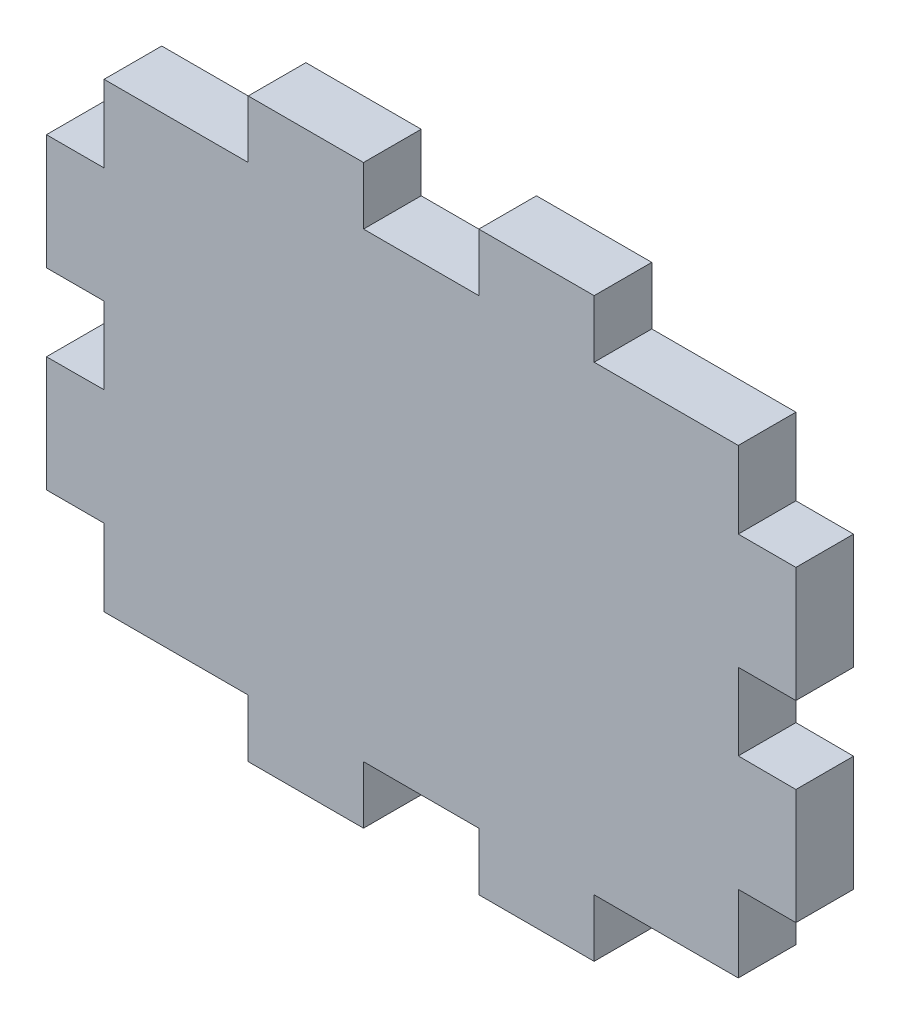
ISO-10303-21;
HEADER;
FILE_DESCRIPTION(('STEP AP214'),'2;1');
FILE_NAME('part.step','',(''),(''),'','','');
FILE_SCHEMA(('AUTOMOTIVE_DESIGN { 1 0 10303 214 1 1 1 1 }'));
ENDSEC;
DATA;
#1=APPLICATION_CONTEXT('core data for automotive mechanical design processes');
#2=APPLICATION_PROTOCOL_DEFINITION('international standard','automotive_design',2000,#1);
#3=PRODUCT_CONTEXT('',#1,'mechanical');
#4=PRODUCT('Part','Part','',(#3));
#5=PRODUCT_RELATED_PRODUCT_CATEGORY('part','',(#4));
#6=PRODUCT_DEFINITION_FORMATION('','',#4);
#7=PRODUCT_DEFINITION_CONTEXT('part definition',#1,'design');
#8=PRODUCT_DEFINITION('design','',#6,#7);
#9=PRODUCT_DEFINITION_SHAPE('','',#8);
#10=(LENGTH_UNIT() NAMED_UNIT(*) SI_UNIT(.MILLI.,.METRE.));
#11=(NAMED_UNIT(*) PLANE_ANGLE_UNIT() SI_UNIT($,.RADIAN.));
#12=(NAMED_UNIT(*) SI_UNIT($,.STERADIAN.) SOLID_ANGLE_UNIT());
#13=UNCERTAINTY_MEASURE_WITH_UNIT(LENGTH_MEASURE(1.E-05),#10,'distance_accuracy_value','');
#14=(GEOMETRIC_REPRESENTATION_CONTEXT(3) GLOBAL_UNCERTAINTY_ASSIGNED_CONTEXT((#13)) GLOBAL_UNIT_ASSIGNED_CONTEXT((#10,
#11,#12)) REPRESENTATION_CONTEXT('',''));
#15=CARTESIAN_POINT('',(0.,0.,0.));
#16=DIRECTION('',(0.,0.,1.));
#17=DIRECTION('',(1.,0.,0.));
#18=AXIS2_PLACEMENT_3D('',#15,#16,#17);
#19=CARTESIAN_POINT('',(7.50000000000001,0.,2.5));
#20=DIRECTION('',(-1.,0.,0.));
#21=DIRECTION('',(0.,0.,1.));
#22=AXIS2_PLACEMENT_3D('',#19,#20,#21);
#23=PLANE('',#22);
#24=DIRECTION('',(0.,1.,0.));
#25=VECTOR('',#24,1.);
#26=CARTESIAN_POINT('',(7.50000000000001,0.,0.));
#27=LINE('',#26,#25);
#28=CARTESIAN_POINT('',(7.50000000000001,10.,0.));
#29=VERTEX_POINT('',#28);
#30=CARTESIAN_POINT('',(7.50000000000001,12.5,0.));
#31=VERTEX_POINT('',#30);
#32=EDGE_CURVE('E543',#29,#31,#27,.T.);
#33=ORIENTED_EDGE('',*,*,#32,.T.);
#34=DIRECTION('',(0.,0.,-1.));
#35=VECTOR('',#34,1.);
#36=CARTESIAN_POINT('',(7.50000000000001,12.5,2.5));
#37=LINE('',#36,#35);
#38=CARTESIAN_POINT('',(7.50000000000001,12.5,2.5));
#39=VERTEX_POINT('',#38);
#40=EDGE_CURVE('E696',#39,#31,#37,.T.);
#41=ORIENTED_EDGE('',*,*,#40,.F.);
#42=DIRECTION('',(0.,1.,0.));
#43=VECTOR('',#42,1.);
#44=CARTESIAN_POINT('',(7.50000000000001,0.,2.5));
#45=LINE('',#44,#43);
#46=CARTESIAN_POINT('',(7.50000000000001,10.,2.5));
#47=VERTEX_POINT('',#46);
#48=EDGE_CURVE('E701',#47,#39,#45,.T.);
#49=ORIENTED_EDGE('',*,*,#48,.F.);
#50=DIRECTION('',(0.,0.,-1.));
#51=VECTOR('',#50,1.);
#52=CARTESIAN_POINT('',(7.50000000000001,10.,2.5));
#53=LINE('',#52,#51);
#54=EDGE_CURVE('E284',#47,#29,#53,.T.);
#55=ORIENTED_EDGE('',*,*,#54,.T.);
#56=EDGE_LOOP('',(#33,#41,#49,#55));
#57=FACE_BOUND('',#56,.T.);
#58=ADVANCED_FACE('F275',(#57),#23,.F.);
#59=CARTESIAN_POINT('',(0.,12.5,2.5));
#60=DIRECTION('',(0.,1.,0.));
#61=DIRECTION('',(0.,0.,1.));
#62=AXIS2_PLACEMENT_3D('',#59,#60,#61);
#63=PLANE('',#62);
#64=DIRECTION('',(1.,0.,0.));
#65=VECTOR('',#64,1.);
#66=CARTESIAN_POINT('',(0.,12.5,0.));
#67=LINE('',#66,#65);
#68=CARTESIAN_POINT('',(2.50000000000001,12.5,0.));
#69=VERTEX_POINT('',#68);
#70=EDGE_CURVE('E548',#69,#31,#67,.T.);
#71=ORIENTED_EDGE('',*,*,#70,.F.);
#72=DIRECTION('',(0.,0.,-1.));
#73=VECTOR('',#72,1.);
#74=CARTESIAN_POINT('',(2.50000000000001,12.5,2.5));
#75=LINE('',#74,#73);
#76=CARTESIAN_POINT('',(2.50000000000001,12.5,2.5));
#77=VERTEX_POINT('',#76);
#78=EDGE_CURVE('E694',#77,#69,#75,.T.);
#79=ORIENTED_EDGE('',*,*,#78,.F.);
#80=DIRECTION('',(1.,0.,0.));
#81=VECTOR('',#80,1.);
#82=CARTESIAN_POINT('',(0.,12.5,2.5));
#83=LINE('',#82,#81);
#84=EDGE_CURVE('E848',#77,#39,#83,.T.);
#85=ORIENTED_EDGE('',*,*,#84,.T.);
#86=ORIENTED_EDGE('',*,*,#40,.T.);
#87=EDGE_LOOP('',(#71,#79,#85,#86));
#88=FACE_BOUND('',#87,.T.);
#89=ADVANCED_FACE('F733',(#88),#63,.T.);
#90=CARTESIAN_POINT('',(2.50000000000001,0.,2.5));
#91=DIRECTION('',(-1.,0.,0.));
#92=DIRECTION('',(0.,-1.,0.));
#93=AXIS2_PLACEMENT_3D('',#90,#91,#92);
#94=PLANE('',#93);
#95=DIRECTION('',(0.,1.,0.));
#96=VECTOR('',#95,1.);
#97=CARTESIAN_POINT('',(2.50000000000001,0.,0.));
#98=LINE('',#97,#96);
#99=CARTESIAN_POINT('',(2.50000000000001,10.,0.));
#100=VERTEX_POINT('',#99);
#101=EDGE_CURVE('E551',#100,#69,#98,.T.);
#102=ORIENTED_EDGE('',*,*,#101,.F.);
#103=DIRECTION('',(0.,0.,-1.));
#104=VECTOR('',#103,1.);
#105=CARTESIAN_POINT('',(2.50000000000001,10.,2.5));
#106=LINE('',#105,#104);
#107=CARTESIAN_POINT('',(2.50000000000001,10.,2.5));
#108=VERTEX_POINT('',#107);
#109=EDGE_CURVE('E692',#108,#100,#106,.T.);
#110=ORIENTED_EDGE('',*,*,#109,.F.);
#111=DIRECTION('',(0.,1.,0.));
#112=VECTOR('',#111,1.);
#113=CARTESIAN_POINT('',(2.50000000000001,0.,2.5));
#114=LINE('',#113,#112);
#115=EDGE_CURVE('E845',#108,#77,#114,.T.);
#116=ORIENTED_EDGE('',*,*,#115,.T.);
#117=ORIENTED_EDGE('',*,*,#78,.T.);
#118=EDGE_LOOP('',(#102,#110,#116,#117));
#119=FACE_BOUND('',#118,.T.);
#120=ADVANCED_FACE('F723',(#119),#94,.T.);
#121=CARTESIAN_POINT('',(0.,0.,0.));
#122=DIRECTION('',(0.,0.,1.));
#123=DIRECTION('',(1.,0.,0.));
#124=AXIS2_PLACEMENT_3D('',#121,#122,#123);
#125=PLANE('',#124);
#126=DIRECTION('',(0.,-1.,0.));
#127=VECTOR('',#126,1.);
#128=CARTESIAN_POINT('',(2.5,0.,0.));
#129=LINE('',#128,#127);
#130=CARTESIAN_POINT('',(2.50000000000001,-10.,0.));
#131=VERTEX_POINT('',#130);
#132=CARTESIAN_POINT('',(2.50000000000001,-12.5,0.));
#133=VERTEX_POINT('',#132);
#134=EDGE_CURVE('E593',#131,#133,#129,.T.);
#135=ORIENTED_EDGE('',*,*,#134,.F.);
#136=DIRECTION('',(1.,0.,0.));
#137=VECTOR('',#136,1.);
#138=CARTESIAN_POINT('',(0.,-10.,0.));
#139=LINE('',#138,#137);
#140=CARTESIAN_POINT('',(-2.49999999999999,-10.,0.));
#141=VERTEX_POINT('',#140);
#142=EDGE_CURVE('E585',#141,#131,#139,.T.);
#143=ORIENTED_EDGE('',*,*,#142,.F.);
#144=DIRECTION('',(0.,-1.,0.));
#145=VECTOR('',#144,1.);
#146=CARTESIAN_POINT('',(-2.5,0.,0.));
#147=LINE('',#146,#145);
#148=CARTESIAN_POINT('',(-2.49999999999999,-12.5000000000001,0.));
#149=VERTEX_POINT('',#148);
#150=EDGE_CURVE('E590',#141,#149,#147,.T.);
#151=ORIENTED_EDGE('',*,*,#150,.T.);
#152=DIRECTION('',(1.,0.,0.));
#153=VECTOR('',#152,1.);
#154=CARTESIAN_POINT('',(0.,-12.5000000000001,0.));
#155=LINE('',#154,#153);
#156=CARTESIAN_POINT('',(-7.49999999999999,-12.5000000000001,0.));
#157=VERTEX_POINT('',#156);
#158=EDGE_CURVE('E587',#157,#149,#155,.T.);
#159=ORIENTED_EDGE('',*,*,#158,.F.);
#160=DIRECTION('',(0.,-1.,0.));
#161=VECTOR('',#160,1.);
#162=CARTESIAN_POINT('',(-7.5,0.,0.));
#163=LINE('',#162,#161);
#164=CARTESIAN_POINT('',(-7.49999999999999,-10.,0.));
#165=VERTEX_POINT('',#164);
#166=EDGE_CURVE('E583',#165,#157,#163,.T.);
#167=ORIENTED_EDGE('',*,*,#166,.F.);
#168=CARTESIAN_POINT('',(-13.75,-10.,0.));
#169=VERTEX_POINT('',#168);
#170=EDGE_CURVE('E581',#169,#165,#139,.T.);
#171=ORIENTED_EDGE('',*,*,#170,.F.);
#172=DIRECTION('',(0.,-1.,0.));
#173=VECTOR('',#172,1.);
#174=CARTESIAN_POINT('',(-13.75,0.,0.));
#175=LINE('',#174,#173);
#176=CARTESIAN_POINT('',(-13.75,-6.67,0.));
#177=VERTEX_POINT('',#176);
#178=EDGE_CURVE('E579',#177,#169,#175,.T.);
#179=ORIENTED_EDGE('',*,*,#178,.F.);
#180=DIRECTION('',(1.,0.,0.));
#181=VECTOR('',#180,1.);
#182=CARTESIAN_POINT('',(0.,-6.66999999999998,0.));
#183=LINE('',#182,#181);
#184=CARTESIAN_POINT('',(-16.25,-6.67,0.));
#185=VERTEX_POINT('',#184);
#186=EDGE_CURVE('E577',#185,#177,#183,.T.);
#187=ORIENTED_EDGE('',*,*,#186,.F.);
#188=DIRECTION('',(0.,-1.,0.));
#189=VECTOR('',#188,1.);
#190=CARTESIAN_POINT('',(-16.25,0.,0.));
#191=LINE('',#190,#189);
#192=CARTESIAN_POINT('',(-16.25,-1.67,0.));
#193=VERTEX_POINT('',#192);
#194=EDGE_CURVE('E575',#193,#185,#191,.T.);
#195=ORIENTED_EDGE('',*,*,#194,.F.);
#196=DIRECTION('',(-0.999992000095999,-0.00399996800038713,0.));
#197=VECTOR('',#196,1.);
#198=CARTESIAN_POINT('',(0.00641989728164832,-1.60497432041082,0.));
#199=LINE('',#198,#197);
#200=CARTESIAN_POINT('',(-13.75,-1.65999999999999,0.));
#201=VERTEX_POINT('',#200);
#202=EDGE_CURVE('E573',#201,#193,#199,.T.);
#203=ORIENTED_EDGE('',*,*,#202,.F.);
#204=DIRECTION('',(0.,-1.,0.));
#205=VECTOR('',#204,1.);
#206=CARTESIAN_POINT('',(-13.75,0.,0.));
#207=LINE('',#206,#205);
#208=CARTESIAN_POINT('',(-13.75,1.67000000000001,0.));
#209=VERTEX_POINT('',#208);
#210=EDGE_CURVE('E571',#209,#201,#207,.T.);
#211=ORIENTED_EDGE('',*,*,#210,.F.);
#212=DIRECTION('',(1.,0.,0.));
#213=VECTOR('',#212,1.);
#214=CARTESIAN_POINT('',(0.,1.67000000000004,0.));
#215=LINE('',#214,#213);
#216=CARTESIAN_POINT('',(-16.25,1.67,0.));
#217=VERTEX_POINT('',#216);
#218=EDGE_CURVE('E569',#217,#209,#215,.T.);
#219=ORIENTED_EDGE('',*,*,#218,.F.);
#220=DIRECTION('',(0.,-1.,0.));
#221=VECTOR('',#220,1.);
#222=CARTESIAN_POINT('',(-16.25,0.,0.));
#223=LINE('',#222,#221);
#224=CARTESIAN_POINT('',(-16.25,6.67,0.));
#225=VERTEX_POINT('',#224);
#226=EDGE_CURVE('E567',#225,#217,#223,.T.);
#227=ORIENTED_EDGE('',*,*,#226,.F.);
#228=DIRECTION('',(-1.,0.,0.));
#229=VECTOR('',#228,1.);
#230=CARTESIAN_POINT('',(0.,6.67000000000005,0.));
#231=LINE('',#230,#229);
#232=CARTESIAN_POINT('',(-13.75,6.67000000000001,0.));
#233=VERTEX_POINT('',#232);
#234=EDGE_CURVE('E565',#233,#225,#231,.T.);
#235=ORIENTED_EDGE('',*,*,#234,.F.);
#236=DIRECTION('',(0.,-1.,0.));
#237=VECTOR('',#236,1.);
#238=CARTESIAN_POINT('',(-13.75,0.,0.));
#239=LINE('',#238,#237);
#240=CARTESIAN_POINT('',(-13.75,10.,0.));
#241=VERTEX_POINT('',#240);
#242=EDGE_CURVE('E563',#241,#233,#239,.T.);
#243=ORIENTED_EDGE('',*,*,#242,.F.);
#244=DIRECTION('',(1.,0.,0.));
#245=VECTOR('',#244,1.);
#246=CARTESIAN_POINT('',(0.,10.,0.));
#247=LINE('',#246,#245);
#248=CARTESIAN_POINT('',(-7.49999999999999,10.,0.));
#249=VERTEX_POINT('',#248);
#250=EDGE_CURVE('E544',#241,#249,#247,.T.);
#251=ORIENTED_EDGE('',*,*,#250,.T.);
#252=DIRECTION('',(0.,1.,0.));
#253=VECTOR('',#252,1.);
#254=CARTESIAN_POINT('',(-7.49999999999999,0.,0.));
#255=LINE('',#254,#253);
#256=CARTESIAN_POINT('',(-7.49999999999999,12.4999999999999,0.));
#257=VERTEX_POINT('',#256);
#258=EDGE_CURVE('E560',#249,#257,#255,.T.);
#259=ORIENTED_EDGE('',*,*,#258,.T.);
#260=DIRECTION('',(1.,0.,0.));
#261=VECTOR('',#260,1.);
#262=CARTESIAN_POINT('',(0.,12.4999999999999,0.));
#263=LINE('',#262,#261);
#264=CARTESIAN_POINT('',(-2.49999999999999,12.4999999999999,0.));
#265=VERTEX_POINT('',#264);
#266=EDGE_CURVE('E557',#257,#265,#263,.T.);
#267=ORIENTED_EDGE('',*,*,#266,.T.);
#268=DIRECTION('',(0.,1.,0.));
#269=VECTOR('',#268,1.);
#270=CARTESIAN_POINT('',(-2.49999999999999,0.,0.));
#271=LINE('',#270,#269);
#272=CARTESIAN_POINT('',(-2.49999999999999,10.,0.));
#273=VERTEX_POINT('',#272);
#274=EDGE_CURVE('E554',#273,#265,#271,.T.);
#275=ORIENTED_EDGE('',*,*,#274,.F.);
#276=EDGE_CURVE('E545',#273,#100,#247,.T.);
#277=ORIENTED_EDGE('',*,*,#276,.T.);
#278=ORIENTED_EDGE('',*,*,#101,.T.);
#279=ORIENTED_EDGE('',*,*,#70,.T.);
#280=ORIENTED_EDGE('',*,*,#32,.F.);
#281=CARTESIAN_POINT('',(13.75,10.,0.));
#282=VERTEX_POINT('',#281);
#283=EDGE_CURVE('E540',#29,#282,#247,.T.);
#284=ORIENTED_EDGE('',*,*,#283,.T.);
#285=DIRECTION('',(0.,-1.,0.));
#286=VECTOR('',#285,1.);
#287=CARTESIAN_POINT('',(13.75,0.,0.));
#288=LINE('',#287,#286);
#289=CARTESIAN_POINT('',(13.75,6.67000000000001,0.));
#290=VERTEX_POINT('',#289);
#291=EDGE_CURVE('E538',#282,#290,#288,.T.);
#292=ORIENTED_EDGE('',*,*,#291,.T.);
#293=DIRECTION('',(1.,0.,0.));
#294=VECTOR('',#293,1.);
#295=CARTESIAN_POINT('',(0.,6.67000000000005,0.));
#296=LINE('',#295,#294);
#297=CARTESIAN_POINT('',(16.25,6.67000000000001,0.));
#298=VERTEX_POINT('',#297);
#299=EDGE_CURVE('E619',#290,#298,#296,.T.);
#300=ORIENTED_EDGE('',*,*,#299,.T.);
#301=DIRECTION('',(0.,-1.,0.));
#302=VECTOR('',#301,1.);
#303=CARTESIAN_POINT('',(16.25,0.,0.));
#304=LINE('',#303,#302);
#305=CARTESIAN_POINT('',(16.25,1.67,0.));
#306=VERTEX_POINT('',#305);
#307=EDGE_CURVE('E617',#298,#306,#304,.T.);
#308=ORIENTED_EDGE('',*,*,#307,.T.);
#309=DIRECTION('',(-1.,0.,0.));
#310=VECTOR('',#309,1.);
#311=CARTESIAN_POINT('',(0.,1.67000000000004,0.));
#312=LINE('',#311,#310);
#313=CARTESIAN_POINT('',(13.75,1.67000000000001,0.));
#314=VERTEX_POINT('',#313);
#315=EDGE_CURVE('E515',#306,#314,#312,.T.);
#316=ORIENTED_EDGE('',*,*,#315,.T.);
#317=DIRECTION('',(0.,-1.,0.));
#318=VECTOR('',#317,1.);
#319=CARTESIAN_POINT('',(13.75,0.,0.));
#320=LINE('',#319,#318);
#321=CARTESIAN_POINT('',(13.75,-1.65999999999999,0.));
#322=VERTEX_POINT('',#321);
#323=EDGE_CURVE('E613',#314,#322,#320,.T.);
#324=ORIENTED_EDGE('',*,*,#323,.T.);
#325=DIRECTION('',(0.999992000095999,-0.00399996800038696,0.));
#326=VECTOR('',#325,1.);
#327=CARTESIAN_POINT('',(-0.00641989728164804,-1.60497432041082,0.));
#328=LINE('',#327,#326);
#329=CARTESIAN_POINT('',(16.25,-1.67,0.));
#330=VERTEX_POINT('',#329);
#331=EDGE_CURVE('E610',#322,#330,#328,.T.);
#332=ORIENTED_EDGE('',*,*,#331,.T.);
#333=DIRECTION('',(0.,-1.,0.));
#334=VECTOR('',#333,1.);
#335=CARTESIAN_POINT('',(16.25,0.,0.));
#336=LINE('',#335,#334);
#337=CARTESIAN_POINT('',(16.25,-6.67,0.));
#338=VERTEX_POINT('',#337);
#339=EDGE_CURVE('E607',#330,#338,#336,.T.);
#340=ORIENTED_EDGE('',*,*,#339,.T.);
#341=DIRECTION('',(-1.,0.,0.));
#342=VECTOR('',#341,1.);
#343=CARTESIAN_POINT('',(0.,-6.66999999999998,0.));
#344=LINE('',#343,#342);
#345=CARTESIAN_POINT('',(13.75,-6.66999999999999,0.));
#346=VERTEX_POINT('',#345);
#347=EDGE_CURVE('E604',#338,#346,#344,.T.);
#348=ORIENTED_EDGE('',*,*,#347,.T.);
#349=DIRECTION('',(0.,-1.,0.));
#350=VECTOR('',#349,1.);
#351=CARTESIAN_POINT('',(13.75,0.,0.));
#352=LINE('',#351,#350);
#353=CARTESIAN_POINT('',(13.75,-10.,0.));
#354=VERTEX_POINT('',#353);
#355=EDGE_CURVE('E601',#346,#354,#352,.T.);
#356=ORIENTED_EDGE('',*,*,#355,.T.);
#357=CARTESIAN_POINT('',(7.50000000000001,-10.,0.));
#358=VERTEX_POINT('',#357);
#359=EDGE_CURVE('E584',#358,#354,#139,.T.);
#360=ORIENTED_EDGE('',*,*,#359,.F.);
#361=DIRECTION('',(0.,-1.,0.));
#362=VECTOR('',#361,1.);
#363=CARTESIAN_POINT('',(7.5,0.,0.));
#364=LINE('',#363,#362);
#365=CARTESIAN_POINT('',(7.50000000000001,-12.5,0.));
#366=VERTEX_POINT('',#365);
#367=EDGE_CURVE('E598',#358,#366,#364,.T.);
#368=ORIENTED_EDGE('',*,*,#367,.T.);
#369=DIRECTION('',(1.,0.,0.));
#370=VECTOR('',#369,1.);
#371=CARTESIAN_POINT('',(0.,-12.5,0.));
#372=LINE('',#371,#370);
#373=EDGE_CURVE('E595',#133,#366,#372,.T.);
#374=ORIENTED_EDGE('',*,*,#373,.F.);
#375=EDGE_LOOP('',(#135,#143,#151,#159,#167,#171,#179,#187,#195,#203,#211,#219,#227,#235,#243,
#251,#259,#267,#275,#277,#278,#279,#280,#284,#292,#300,#308,#316,#324,#332,#340,#348,#356,#360,
#368,#374));
#376=FACE_BOUND('',#375,.T.);
#377=ADVANCED_FACE('F708',(#376),#125,.F.);
#378=CARTESIAN_POINT('',(2.5,0.,2.5));
#379=DIRECTION('',(1.,0.,0.));
#380=DIRECTION('',(0.,1.,0.));
#381=AXIS2_PLACEMENT_3D('',#378,#379,#380);
#382=PLANE('',#381);
#383=ORIENTED_EDGE('',*,*,#134,.T.);
#384=DIRECTION('',(0.,0.,-1.));
#385=VECTOR('',#384,1.);
#386=CARTESIAN_POINT('',(2.50000000000001,-12.5,2.5));
#387=LINE('',#386,#385);
#388=CARTESIAN_POINT('',(2.50000000000001,-12.5,2.5));
#389=VERTEX_POINT('',#388);
#390=EDGE_CURVE('E640',#389,#133,#387,.T.);
#391=ORIENTED_EDGE('',*,*,#390,.F.);
#392=DIRECTION('',(0.,-1.,0.));
#393=VECTOR('',#392,1.);
#394=CARTESIAN_POINT('',(2.5,0.,2.5));
#395=LINE('',#394,#393);
#396=CARTESIAN_POINT('',(2.50000000000001,-10.,2.5));
#397=VERTEX_POINT('',#396);
#398=EDGE_CURVE('E891',#397,#389,#395,.T.);
#399=ORIENTED_EDGE('',*,*,#398,.F.);
#400=DIRECTION('',(0.,0.,-1.));
#401=VECTOR('',#400,1.);
#402=CARTESIAN_POINT('',(2.50000000000001,-10.,2.5));
#403=LINE('',#402,#401);
#404=EDGE_CURVE('E643',#397,#131,#403,.T.);
#405=ORIENTED_EDGE('',*,*,#404,.T.);
#406=EDGE_LOOP('',(#383,#391,#399,#405));
#407=FACE_BOUND('',#406,.T.);
#408=ADVANCED_FACE('F722',(#407),#382,.F.);
#409=CARTESIAN_POINT('',(0.,-12.5,2.5));
#410=DIRECTION('',(0.,1.,0.));
#411=DIRECTION('',(0.,0.,1.));
#412=AXIS2_PLACEMENT_3D('',#409,#410,#411);
#413=PLANE('',#412);
#414=ORIENTED_EDGE('',*,*,#373,.T.);
#415=DIRECTION('',(0.,0.,-1.));
#416=VECTOR('',#415,1.);
#417=CARTESIAN_POINT('',(7.50000000000001,-12.5,2.5));
#418=LINE('',#417,#416);
#419=CARTESIAN_POINT('',(7.50000000000001,-12.5,2.5));
#420=VERTEX_POINT('',#419);
#421=EDGE_CURVE('E638',#420,#366,#418,.T.);
#422=ORIENTED_EDGE('',*,*,#421,.F.);
#423=DIRECTION('',(1.,0.,0.));
#424=VECTOR('',#423,1.);
#425=CARTESIAN_POINT('',(0.,-12.5,2.5));
#426=LINE('',#425,#424);
#427=EDGE_CURVE('E893',#389,#420,#426,.T.);
#428=ORIENTED_EDGE('',*,*,#427,.F.);
#429=ORIENTED_EDGE('',*,*,#390,.T.);
#430=EDGE_LOOP('',(#414,#422,#428,#429));
#431=FACE_BOUND('',#430,.T.);
#432=ADVANCED_FACE('F729',(#431),#413,.F.);
#433=CARTESIAN_POINT('',(7.5,0.,2.5));
#434=DIRECTION('',(1.,0.,0.));
#435=DIRECTION('',(0.,1.,0.));
#436=AXIS2_PLACEMENT_3D('',#433,#434,#435);
#437=PLANE('',#436);
#438=ORIENTED_EDGE('',*,*,#367,.F.);
#439=DIRECTION('',(0.,0.,-1.));
#440=VECTOR('',#439,1.);
#441=CARTESIAN_POINT('',(7.50000000000001,-10.,2.5));
#442=LINE('',#441,#440);
#443=CARTESIAN_POINT('',(7.50000000000001,-10.,2.5));
#444=VERTEX_POINT('',#443);
#445=EDGE_CURVE('E636',#444,#358,#442,.T.);
#446=ORIENTED_EDGE('',*,*,#445,.F.);
#447=DIRECTION('',(0.,-1.,0.));
#448=VECTOR('',#447,1.);
#449=CARTESIAN_POINT('',(7.5,0.,2.5));
#450=LINE('',#449,#448);
#451=EDGE_CURVE('E895',#444,#420,#450,.T.);
#452=ORIENTED_EDGE('',*,*,#451,.T.);
#453=ORIENTED_EDGE('',*,*,#421,.T.);
#454=EDGE_LOOP('',(#438,#446,#452,#453));
#455=FACE_BOUND('',#454,.T.);
#456=ADVANCED_FACE('F748',(#455),#437,.T.);
#457=CARTESIAN_POINT('',(0.,0.,2.5));
#458=DIRECTION('',(0.,0.,1.));
#459=DIRECTION('',(1.,0.,0.));
#460=AXIS2_PLACEMENT_3D('',#457,#458,#459);
#461=PLANE('',#460);
#462=ORIENTED_EDGE('',*,*,#451,.F.);
#463=DIRECTION('',(1.,0.,0.));
#464=VECTOR('',#463,1.);
#465=CARTESIAN_POINT('',(0.,-10.,2.5));
#466=LINE('',#465,#464);
#467=CARTESIAN_POINT('',(13.75,-10.,2.5));
#468=VERTEX_POINT('',#467);
#469=EDGE_CURVE('E883',#444,#468,#466,.T.);
#470=ORIENTED_EDGE('',*,*,#469,.T.);
#471=DIRECTION('',(0.,-1.,0.));
#472=VECTOR('',#471,1.);
#473=CARTESIAN_POINT('',(13.75,0.,2.5));
#474=LINE('',#473,#472);
#475=CARTESIAN_POINT('',(13.75,-6.66999999999999,2.5));
#476=VERTEX_POINT('',#475);
#477=EDGE_CURVE('E898',#476,#468,#474,.T.);
#478=ORIENTED_EDGE('',*,*,#477,.F.);
#479=DIRECTION('',(-1.,0.,0.));
#480=VECTOR('',#479,1.);
#481=CARTESIAN_POINT('',(0.,-6.66999999999998,2.5));
#482=LINE('',#481,#480);
#483=CARTESIAN_POINT('',(16.25,-6.67,2.5));
#484=VERTEX_POINT('',#483);
#485=EDGE_CURVE('E901',#484,#476,#482,.T.);
#486=ORIENTED_EDGE('',*,*,#485,.F.);
#487=DIRECTION('',(0.,-1.,0.));
#488=VECTOR('',#487,1.);
#489=CARTESIAN_POINT('',(16.25,0.,2.5));
#490=LINE('',#489,#488);
#491=CARTESIAN_POINT('',(16.25,-1.67,2.5));
#492=VERTEX_POINT('',#491);
#493=EDGE_CURVE('E904',#492,#484,#490,.T.);
#494=ORIENTED_EDGE('',*,*,#493,.F.);
#495=DIRECTION('',(0.999992000095999,-0.00399996800038696,0.));
#496=VECTOR('',#495,1.);
#497=CARTESIAN_POINT('',(-0.00641989728164804,-1.60497432041082,2.5));
#498=LINE('',#497,#496);
#499=CARTESIAN_POINT('',(13.75,-1.65999999999999,2.5));
#500=VERTEX_POINT('',#499);
#501=EDGE_CURVE('E907',#500,#492,#498,.T.);
#502=ORIENTED_EDGE('',*,*,#501,.F.);
#503=DIRECTION('',(0.,-1.,0.));
#504=VECTOR('',#503,1.);
#505=CARTESIAN_POINT('',(13.75,0.,2.5));
#506=LINE('',#505,#504);
#507=CARTESIAN_POINT('',(13.75,1.67000000000001,2.5));
#508=VERTEX_POINT('',#507);
#509=EDGE_CURVE('E530',#508,#500,#506,.T.);
#510=ORIENTED_EDGE('',*,*,#509,.F.);
#511=DIRECTION('',(-1.,0.,0.));
#512=VECTOR('',#511,1.);
#513=CARTESIAN_POINT('',(0.,1.67000000000004,2.5));
#514=LINE('',#513,#512);
#515=CARTESIAN_POINT('',(16.25,1.67,2.5));
#516=VERTEX_POINT('',#515);
#517=EDGE_CURVE('E513',#516,#508,#514,.T.);
#518=ORIENTED_EDGE('',*,*,#517,.F.);
#519=DIRECTION('',(0.,-1.,0.));
#520=VECTOR('',#519,1.);
#521=CARTESIAN_POINT('',(16.25,0.,2.5));
#522=LINE('',#521,#520);
#523=CARTESIAN_POINT('',(16.25,6.67000000000001,2.5));
#524=VERTEX_POINT('',#523);
#525=EDGE_CURVE('E527',#524,#516,#522,.T.);
#526=ORIENTED_EDGE('',*,*,#525,.F.);
#527=DIRECTION('',(1.,0.,0.));
#528=VECTOR('',#527,1.);
#529=CARTESIAN_POINT('',(0.,6.67000000000005,2.5));
#530=LINE('',#529,#528);
#531=CARTESIAN_POINT('',(13.75,6.67000000000001,2.5));
#532=VERTEX_POINT('',#531);
#533=EDGE_CURVE('E533',#532,#524,#530,.T.);
#534=ORIENTED_EDGE('',*,*,#533,.F.);
#535=DIRECTION('',(0.,-1.,0.));
#536=VECTOR('',#535,1.);
#537=CARTESIAN_POINT('',(13.75,0.,2.5));
#538=LINE('',#537,#536);
#539=CARTESIAN_POINT('',(13.75,10.,2.5));
#540=VERTEX_POINT('',#539);
#541=EDGE_CURVE('E622',#540,#532,#538,.T.);
#542=ORIENTED_EDGE('',*,*,#541,.F.);
#543=DIRECTION('',(1.,0.,0.));
#544=VECTOR('',#543,1.);
#545=CARTESIAN_POINT('',(0.,10.,2.5));
#546=LINE('',#545,#544);
#547=EDGE_CURVE('E711',#47,#540,#546,.T.);
#548=ORIENTED_EDGE('',*,*,#547,.F.);
#549=ORIENTED_EDGE('',*,*,#48,.T.);
#550=ORIENTED_EDGE('',*,*,#84,.F.);
#551=ORIENTED_EDGE('',*,*,#115,.F.);
#552=CARTESIAN_POINT('',(-2.49999999999999,10.,2.5));
#553=VERTEX_POINT('',#552);
#554=EDGE_CURVE('E842',#553,#108,#546,.T.);
#555=ORIENTED_EDGE('',*,*,#554,.F.);
#556=DIRECTION('',(0.,1.,0.));
#557=VECTOR('',#556,1.);
#558=CARTESIAN_POINT('',(-2.49999999999999,0.,2.5));
#559=LINE('',#558,#557);
#560=CARTESIAN_POINT('',(-2.49999999999999,12.4999999999999,2.5));
#561=VERTEX_POINT('',#560);
#562=EDGE_CURVE('E854',#553,#561,#559,.T.);
#563=ORIENTED_EDGE('',*,*,#562,.T.);
#564=DIRECTION('',(1.,0.,0.));
#565=VECTOR('',#564,1.);
#566=CARTESIAN_POINT('',(0.,12.4999999999999,2.5));
#567=LINE('',#566,#565);
#568=CARTESIAN_POINT('',(-7.49999999999999,12.4999999999999,2.5));
#569=VERTEX_POINT('',#568);
#570=EDGE_CURVE('E856',#569,#561,#567,.T.);
#571=ORIENTED_EDGE('',*,*,#570,.F.);
#572=DIRECTION('',(0.,1.,0.));
#573=VECTOR('',#572,1.);
#574=CARTESIAN_POINT('',(-7.49999999999999,0.,2.5));
#575=LINE('',#574,#573);
#576=CARTESIAN_POINT('',(-7.49999999999999,10.,2.5));
#577=VERTEX_POINT('',#576);
#578=EDGE_CURVE('E859',#577,#569,#575,.T.);
#579=ORIENTED_EDGE('',*,*,#578,.F.);
#580=CARTESIAN_POINT('',(-13.75,10.,2.5));
#581=VERTEX_POINT('',#580);
#582=EDGE_CURVE('E861',#581,#577,#546,.T.);
#583=ORIENTED_EDGE('',*,*,#582,.F.);
#584=DIRECTION('',(0.,-1.,0.));
#585=VECTOR('',#584,1.);
#586=CARTESIAN_POINT('',(-13.75,0.,2.5));
#587=LINE('',#586,#585);
#588=CARTESIAN_POINT('',(-13.75,6.67000000000001,2.5));
#589=VERTEX_POINT('',#588);
#590=EDGE_CURVE('E862',#581,#589,#587,.T.);
#591=ORIENTED_EDGE('',*,*,#590,.T.);
#592=DIRECTION('',(-1.,0.,0.));
#593=VECTOR('',#592,1.);
#594=CARTESIAN_POINT('',(0.,6.67000000000005,2.5));
#595=LINE('',#594,#593);
#596=CARTESIAN_POINT('',(-16.25,6.67,2.5));
#597=VERTEX_POINT('',#596);
#598=EDGE_CURVE('E864',#589,#597,#595,.T.);
#599=ORIENTED_EDGE('',*,*,#598,.T.);
#600=DIRECTION('',(0.,-1.,0.));
#601=VECTOR('',#600,1.);
#602=CARTESIAN_POINT('',(-16.25,0.,2.5));
#603=LINE('',#602,#601);
#604=CARTESIAN_POINT('',(-16.25,1.67,2.5));
#605=VERTEX_POINT('',#604);
#606=EDGE_CURVE('E866',#597,#605,#603,.T.);
#607=ORIENTED_EDGE('',*,*,#606,.T.);
#608=DIRECTION('',(1.,0.,0.));
#609=VECTOR('',#608,1.);
#610=CARTESIAN_POINT('',(0.,1.67000000000004,2.5));
#611=LINE('',#610,#609);
#612=CARTESIAN_POINT('',(-13.75,1.67000000000001,2.5));
#613=VERTEX_POINT('',#612);
#614=EDGE_CURVE('E868',#605,#613,#611,.T.);
#615=ORIENTED_EDGE('',*,*,#614,.T.);
#616=DIRECTION('',(0.,-1.,0.));
#617=VECTOR('',#616,1.);
#618=CARTESIAN_POINT('',(-13.75,0.,2.5));
#619=LINE('',#618,#617);
#620=CARTESIAN_POINT('',(-13.75,-1.65999999999999,2.5));
#621=VERTEX_POINT('',#620);
#622=EDGE_CURVE('E870',#613,#621,#619,.T.);
#623=ORIENTED_EDGE('',*,*,#622,.T.);
#624=DIRECTION('',(-0.999992000095999,-0.00399996800038713,0.));
#625=VECTOR('',#624,1.);
#626=CARTESIAN_POINT('',(0.00641989728164832,-1.60497432041082,2.5));
#627=LINE('',#626,#625);
#628=CARTESIAN_POINT('',(-16.25,-1.67,2.5));
#629=VERTEX_POINT('',#628);
#630=EDGE_CURVE('E872',#621,#629,#627,.T.);
#631=ORIENTED_EDGE('',*,*,#630,.T.);
#632=DIRECTION('',(0.,-1.,0.));
#633=VECTOR('',#632,1.);
#634=CARTESIAN_POINT('',(-16.25,0.,2.5));
#635=LINE('',#634,#633);
#636=CARTESIAN_POINT('',(-16.25,-6.67,2.5));
#637=VERTEX_POINT('',#636);
#638=EDGE_CURVE('E874',#629,#637,#635,.T.);
#639=ORIENTED_EDGE('',*,*,#638,.T.);
#640=DIRECTION('',(1.,0.,0.));
#641=VECTOR('',#640,1.);
#642=CARTESIAN_POINT('',(0.,-6.66999999999998,2.5));
#643=LINE('',#642,#641);
#644=CARTESIAN_POINT('',(-13.75,-6.67,2.5));
#645=VERTEX_POINT('',#644);
#646=EDGE_CURVE('E876',#637,#645,#643,.T.);
#647=ORIENTED_EDGE('',*,*,#646,.T.);
#648=DIRECTION('',(0.,-1.,0.));
#649=VECTOR('',#648,1.);
#650=CARTESIAN_POINT('',(-13.75,0.,2.5));
#651=LINE('',#650,#649);
#652=CARTESIAN_POINT('',(-13.75,-10.,2.5));
#653=VERTEX_POINT('',#652);
#654=EDGE_CURVE('E878',#645,#653,#651,.T.);
#655=ORIENTED_EDGE('',*,*,#654,.T.);
#656=CARTESIAN_POINT('',(-7.49999999999999,-10.,2.5));
#657=VERTEX_POINT('',#656);
#658=EDGE_CURVE('E880',#653,#657,#466,.T.);
#659=ORIENTED_EDGE('',*,*,#658,.T.);
#660=DIRECTION('',(0.,-1.,0.));
#661=VECTOR('',#660,1.);
#662=CARTESIAN_POINT('',(-7.5,0.,2.5));
#663=LINE('',#662,#661);
#664=CARTESIAN_POINT('',(-7.49999999999999,-12.5000000000001,2.5));
#665=VERTEX_POINT('',#664);
#666=EDGE_CURVE('E882',#657,#665,#663,.T.);
#667=ORIENTED_EDGE('',*,*,#666,.T.);
#668=DIRECTION('',(1.,0.,0.));
#669=VECTOR('',#668,1.);
#670=CARTESIAN_POINT('',(0.,-12.5000000000001,2.5));
#671=LINE('',#670,#669);
#672=CARTESIAN_POINT('',(-2.49999999999999,-12.5000000000001,2.5));
#673=VERTEX_POINT('',#672);
#674=EDGE_CURVE('E886',#665,#673,#671,.T.);
#675=ORIENTED_EDGE('',*,*,#674,.T.);
#676=DIRECTION('',(0.,-1.,0.));
#677=VECTOR('',#676,1.);
#678=CARTESIAN_POINT('',(-2.5,0.,2.5));
#679=LINE('',#678,#677);
#680=CARTESIAN_POINT('',(-2.49999999999999,-10.,2.5));
#681=VERTEX_POINT('',#680);
#682=EDGE_CURVE('E888',#681,#673,#679,.T.);
#683=ORIENTED_EDGE('',*,*,#682,.F.);
#684=EDGE_CURVE('E884',#681,#397,#466,.T.);
#685=ORIENTED_EDGE('',*,*,#684,.T.);
#686=ORIENTED_EDGE('',*,*,#398,.T.);
#687=ORIENTED_EDGE('',*,*,#427,.T.);
#688=EDGE_LOOP('',(#462,#470,#478,#486,#494,#502,#510,#518,#526,#534,#542,#548,#549,#550,#551,
#555,#563,#571,#579,#583,#591,#599,#607,#615,#623,#631,#639,#647,#655,#659,#667,#675,#683,#685,
#686,#687));
#689=FACE_BOUND('',#688,.T.);
#690=ADVANCED_FACE('F525',(#689),#461,.T.);
#691=CARTESIAN_POINT('',(-2.49999999999999,0.,2.5));
#692=DIRECTION('',(-1.,0.,0.));
#693=DIRECTION('',(0.,0.,1.));
#694=AXIS2_PLACEMENT_3D('',#691,#692,#693);
#695=PLANE('',#694);
#696=ORIENTED_EDGE('',*,*,#274,.T.);
#697=DIRECTION('',(0.,0.,-1.));
#698=VECTOR('',#697,1.);
#699=CARTESIAN_POINT('',(-2.49999999999999,12.4999999999999,2.5));
#700=LINE('',#699,#698);
#701=EDGE_CURVE('E688',#561,#265,#700,.T.);
#702=ORIENTED_EDGE('',*,*,#701,.F.);
#703=ORIENTED_EDGE('',*,*,#562,.F.);
#704=DIRECTION('',(0.,0.,-1.));
#705=VECTOR('',#704,1.);
#706=CARTESIAN_POINT('',(-2.49999999999999,10.,2.5));
#707=LINE('',#706,#705);
#708=EDGE_CURVE('E690',#553,#273,#707,.T.);
#709=ORIENTED_EDGE('',*,*,#708,.T.);
#710=EDGE_LOOP('',(#696,#702,#703,#709));
#711=FACE_BOUND('',#710,.T.);
#712=ADVANCED_FACE('F724',(#711),#695,.F.);
#713=CARTESIAN_POINT('',(0.,12.4999999999999,2.5));
#714=DIRECTION('',(0.,1.,0.));
#715=DIRECTION('',(0.,0.,1.));
#716=AXIS2_PLACEMENT_3D('',#713,#714,#715);
#717=PLANE('',#716);
#718=ORIENTED_EDGE('',*,*,#266,.F.);
#719=DIRECTION('',(0.,0.,-1.));
#720=VECTOR('',#719,1.);
#721=CARTESIAN_POINT('',(-7.49999999999999,12.4999999999999,2.5));
#722=LINE('',#721,#720);
#723=EDGE_CURVE('E686',#569,#257,#722,.T.);
#724=ORIENTED_EDGE('',*,*,#723,.F.);
#725=ORIENTED_EDGE('',*,*,#570,.T.);
#726=ORIENTED_EDGE('',*,*,#701,.T.);
#727=EDGE_LOOP('',(#718,#724,#725,#726));
#728=FACE_BOUND('',#727,.T.);
#729=ADVANCED_FACE('F738',(#728),#717,.T.);
#730=CARTESIAN_POINT('',(-7.49999999999999,0.,2.5));
#731=DIRECTION('',(-1.,0.,0.));
#732=DIRECTION('',(0.,-1.,0.));
#733=AXIS2_PLACEMENT_3D('',#730,#731,#732);
#734=PLANE('',#733);
#735=ORIENTED_EDGE('',*,*,#258,.F.);
#736=DIRECTION('',(0.,0.,-1.));
#737=VECTOR('',#736,1.);
#738=CARTESIAN_POINT('',(-7.49999999999999,10.,2.5));
#739=LINE('',#738,#737);
#740=EDGE_CURVE('E684',#577,#249,#739,.T.);
#741=ORIENTED_EDGE('',*,*,#740,.F.);
#742=ORIENTED_EDGE('',*,*,#578,.T.);
#743=ORIENTED_EDGE('',*,*,#723,.T.);
#744=EDGE_LOOP('',(#735,#741,#742,#743));
#745=FACE_BOUND('',#744,.T.);
#746=ADVANCED_FACE('F745',(#745),#734,.T.);
#747=CARTESIAN_POINT('',(0.,10.,2.5));
#748=DIRECTION('',(0.,1.,0.));
#749=DIRECTION('',(-1.,0.,0.));
#750=AXIS2_PLACEMENT_3D('',#747,#748,#749);
#751=PLANE('',#750);
#752=ORIENTED_EDGE('',*,*,#250,.F.);
#753=DIRECTION('',(0.,0.,-1.));
#754=VECTOR('',#753,1.);
#755=CARTESIAN_POINT('',(-13.75,10.,2.5));
#756=LINE('',#755,#754);
#757=EDGE_CURVE('E682',#581,#241,#756,.T.);
#758=ORIENTED_EDGE('',*,*,#757,.F.);
#759=ORIENTED_EDGE('',*,*,#582,.T.);
#760=ORIENTED_EDGE('',*,*,#740,.T.);
#761=EDGE_LOOP('',(#752,#758,#759,#760));
#762=FACE_BOUND('',#761,.T.);
#763=ADVANCED_FACE('F818',(#762),#751,.T.);
#764=CARTESIAN_POINT('',(-13.75,0.,2.5));
#765=DIRECTION('',(1.,0.,0.));
#766=DIRECTION('',(0.,1.,0.));
#767=AXIS2_PLACEMENT_3D('',#764,#765,#766);
#768=PLANE('',#767);
#769=ORIENTED_EDGE('',*,*,#242,.T.);
#770=DIRECTION('',(0.,0.,-1.));
#771=VECTOR('',#770,1.);
#772=CARTESIAN_POINT('',(-13.75,6.67000000000001,2.5));
#773=LINE('',#772,#771);
#774=EDGE_CURVE('E679',#589,#233,#773,.T.);
#775=ORIENTED_EDGE('',*,*,#774,.F.);
#776=ORIENTED_EDGE('',*,*,#590,.F.);
#777=ORIENTED_EDGE('',*,*,#757,.T.);
#778=EDGE_LOOP('',(#769,#775,#776,#777));
#779=FACE_BOUND('',#778,.T.);
#780=ADVANCED_FACE('F814',(#779),#768,.F.);
#781=CARTESIAN_POINT('',(0.,6.67000000000005,2.5));
#782=DIRECTION('',(0.,-1.,0.));
#783=DIRECTION('',(1.,0.,0.));
#784=AXIS2_PLACEMENT_3D('',#781,#782,#783);
#785=PLANE('',#784);
#786=ORIENTED_EDGE('',*,*,#234,.T.);
#787=DIRECTION('',(0.,0.,-1.));
#788=VECTOR('',#787,1.);
#789=CARTESIAN_POINT('',(-16.25,6.67,2.5));
#790=LINE('',#789,#788);
#791=EDGE_CURVE('E676',#597,#225,#790,.T.);
#792=ORIENTED_EDGE('',*,*,#791,.F.);
#793=ORIENTED_EDGE('',*,*,#598,.F.);
#794=ORIENTED_EDGE('',*,*,#774,.T.);
#795=EDGE_LOOP('',(#786,#792,#793,#794));
#796=FACE_BOUND('',#795,.T.);
#797=ADVANCED_FACE('F810',(#796),#785,.F.);
#798=CARTESIAN_POINT('',(-16.25,0.,2.5));
#799=DIRECTION('',(1.,0.,0.));
#800=DIRECTION('',(0.,0.,-1.));
#801=AXIS2_PLACEMENT_3D('',#798,#799,#800);
#802=PLANE('',#801);
#803=ORIENTED_EDGE('',*,*,#226,.T.);
#804=DIRECTION('',(0.,0.,-1.));
#805=VECTOR('',#804,1.);
#806=CARTESIAN_POINT('',(-16.25,1.67,2.5));
#807=LINE('',#806,#805);
#808=EDGE_CURVE('E673',#605,#217,#807,.T.);
#809=ORIENTED_EDGE('',*,*,#808,.F.);
#810=ORIENTED_EDGE('',*,*,#606,.F.);
#811=ORIENTED_EDGE('',*,*,#791,.T.);
#812=EDGE_LOOP('',(#803,#809,#810,#811));
#813=FACE_BOUND('',#812,.T.);
#814=ADVANCED_FACE('F806',(#813),#802,.F.);
#815=CARTESIAN_POINT('',(0.,1.67000000000004,2.5));
#816=DIRECTION('',(0.,1.,0.));
#817=DIRECTION('',(-1.,0.,0.));
#818=AXIS2_PLACEMENT_3D('',#815,#816,#817);
#819=PLANE('',#818);
#820=ORIENTED_EDGE('',*,*,#218,.T.);
#821=DIRECTION('',(0.,0.,-1.));
#822=VECTOR('',#821,1.);
#823=CARTESIAN_POINT('',(-13.75,1.67000000000001,2.5));
#824=LINE('',#823,#822);
#825=EDGE_CURVE('E670',#613,#209,#824,.T.);
#826=ORIENTED_EDGE('',*,*,#825,.F.);
#827=ORIENTED_EDGE('',*,*,#614,.F.);
#828=ORIENTED_EDGE('',*,*,#808,.T.);
#829=EDGE_LOOP('',(#820,#826,#827,#828));
#830=FACE_BOUND('',#829,.T.);
#831=ADVANCED_FACE('F802',(#830),#819,.F.);
#832=CARTESIAN_POINT('',(-13.75,0.,2.5));
#833=DIRECTION('',(1.,0.,0.));
#834=DIRECTION('',(0.,0.,-1.));
#835=AXIS2_PLACEMENT_3D('',#832,#833,#834);
#836=PLANE('',#835);
#837=ORIENTED_EDGE('',*,*,#210,.T.);
#838=DIRECTION('',(0.,0.,-1.));
#839=VECTOR('',#838,1.);
#840=CARTESIAN_POINT('',(-13.75,-1.65999999999999,2.5));
#841=LINE('',#840,#839);
#842=EDGE_CURVE('E667',#621,#201,#841,.T.);
#843=ORIENTED_EDGE('',*,*,#842,.F.);
#844=ORIENTED_EDGE('',*,*,#622,.F.);
#845=ORIENTED_EDGE('',*,*,#825,.T.);
#846=EDGE_LOOP('',(#837,#843,#844,#845));
#847=FACE_BOUND('',#846,.T.);
#848=ADVANCED_FACE('F798',(#847),#836,.F.);
#849=CARTESIAN_POINT('',(0.00641989728164832,-1.60497432041082,2.5));
#850=DIRECTION('',(0.00399996800038713,-0.999992000095999,0.));
#851=DIRECTION('',(0.999992000095999,0.00399996800038713,0.));
#852=AXIS2_PLACEMENT_3D('',#849,#850,#851);
#853=PLANE('',#852);
#854=ORIENTED_EDGE('',*,*,#202,.T.);
#855=DIRECTION('',(0.,0.,-1.));
#856=VECTOR('',#855,1.);
#857=CARTESIAN_POINT('',(-16.25,-1.67,2.5));
#858=LINE('',#857,#856);
#859=EDGE_CURVE('E664',#629,#193,#858,.T.);
#860=ORIENTED_EDGE('',*,*,#859,.F.);
#861=ORIENTED_EDGE('',*,*,#630,.F.);
#862=ORIENTED_EDGE('',*,*,#842,.T.);
#863=EDGE_LOOP('',(#854,#860,#861,#862));
#864=FACE_BOUND('',#863,.T.);
#865=ADVANCED_FACE('F794',(#864),#853,.F.);
#866=CARTESIAN_POINT('',(-16.25,0.,2.5));
#867=DIRECTION('',(1.,0.,0.));
#868=DIRECTION('',(0.,1.,0.));
#869=AXIS2_PLACEMENT_3D('',#866,#867,#868);
#870=PLANE('',#869);
#871=ORIENTED_EDGE('',*,*,#194,.T.);
#872=DIRECTION('',(0.,0.,-1.));
#873=VECTOR('',#872,1.);
#874=CARTESIAN_POINT('',(-16.25,-6.67,2.5));
#875=LINE('',#874,#873);
#876=EDGE_CURVE('E661',#637,#185,#875,.T.);
#877=ORIENTED_EDGE('',*,*,#876,.F.);
#878=ORIENTED_EDGE('',*,*,#638,.F.);
#879=ORIENTED_EDGE('',*,*,#859,.T.);
#880=EDGE_LOOP('',(#871,#877,#878,#879));
#881=FACE_BOUND('',#880,.T.);
#882=ADVANCED_FACE('F790',(#881),#870,.F.);
#883=CARTESIAN_POINT('',(0.,-6.66999999999998,2.5));
#884=DIRECTION('',(0.,1.,0.));
#885=DIRECTION('',(-1.,0.,0.));
#886=AXIS2_PLACEMENT_3D('',#883,#884,#885);
#887=PLANE('',#886);
#888=ORIENTED_EDGE('',*,*,#186,.T.);
#889=DIRECTION('',(0.,0.,-1.));
#890=VECTOR('',#889,1.);
#891=CARTESIAN_POINT('',(-13.75,-6.67,2.5));
#892=LINE('',#891,#890);
#893=EDGE_CURVE('E658',#645,#177,#892,.T.);
#894=ORIENTED_EDGE('',*,*,#893,.F.);
#895=ORIENTED_EDGE('',*,*,#646,.F.);
#896=ORIENTED_EDGE('',*,*,#876,.T.);
#897=EDGE_LOOP('',(#888,#894,#895,#896));
#898=FACE_BOUND('',#897,.T.);
#899=ADVANCED_FACE('F786',(#898),#887,.F.);
#900=CARTESIAN_POINT('',(-13.75,0.,2.5));
#901=DIRECTION('',(1.,0.,0.));
#902=DIRECTION('',(0.,0.,-1.));
#903=AXIS2_PLACEMENT_3D('',#900,#901,#902);
#904=PLANE('',#903);
#905=ORIENTED_EDGE('',*,*,#178,.T.);
#906=DIRECTION('',(0.,0.,-1.));
#907=VECTOR('',#906,1.);
#908=CARTESIAN_POINT('',(-13.75,-10.,2.5));
#909=LINE('',#908,#907);
#910=EDGE_CURVE('E655',#653,#169,#909,.T.);
#911=ORIENTED_EDGE('',*,*,#910,.F.);
#912=ORIENTED_EDGE('',*,*,#654,.F.);
#913=ORIENTED_EDGE('',*,*,#893,.T.);
#914=EDGE_LOOP('',(#905,#911,#912,#913));
#915=FACE_BOUND('',#914,.T.);
#916=ADVANCED_FACE('F783',(#915),#904,.F.);
#917=CARTESIAN_POINT('',(0.,-10.,2.5));
#918=DIRECTION('',(0.,1.,0.));
#919=DIRECTION('',(0.,0.,1.));
#920=AXIS2_PLACEMENT_3D('',#917,#918,#919);
#921=PLANE('',#920);
#922=ORIENTED_EDGE('',*,*,#170,.T.);
#923=DIRECTION('',(0.,0.,-1.));
#924=VECTOR('',#923,1.);
#925=CARTESIAN_POINT('',(-7.49999999999999,-10.,2.5));
#926=LINE('',#925,#924);
#927=EDGE_CURVE('E652',#657,#165,#926,.T.);
#928=ORIENTED_EDGE('',*,*,#927,.F.);
#929=ORIENTED_EDGE('',*,*,#658,.F.);
#930=ORIENTED_EDGE('',*,*,#910,.T.);
#931=EDGE_LOOP('',(#922,#928,#929,#930));
#932=FACE_BOUND('',#931,.T.);
#933=ADVANCED_FACE('F781',(#932),#921,.F.);
#934=CARTESIAN_POINT('',(-7.5,0.,2.5));
#935=DIRECTION('',(1.,0.,0.));
#936=DIRECTION('',(0.,1.,0.));
#937=AXIS2_PLACEMENT_3D('',#934,#935,#936);
#938=PLANE('',#937);
#939=ORIENTED_EDGE('',*,*,#166,.T.);
#940=DIRECTION('',(0.,0.,-1.));
#941=VECTOR('',#940,1.);
#942=CARTESIAN_POINT('',(-7.49999999999999,-12.5000000000001,2.5));
#943=LINE('',#942,#941);
#944=EDGE_CURVE('E649',#665,#157,#943,.T.);
#945=ORIENTED_EDGE('',*,*,#944,.F.);
#946=ORIENTED_EDGE('',*,*,#666,.F.);
#947=ORIENTED_EDGE('',*,*,#927,.T.);
#948=EDGE_LOOP('',(#939,#945,#946,#947));
#949=FACE_BOUND('',#948,.T.);
#950=ADVANCED_FACE('F777',(#949),#938,.F.);
#951=CARTESIAN_POINT('',(0.,-12.5000000000001,2.5));
#952=DIRECTION('',(0.,1.,0.));
#953=DIRECTION('',(0.,0.,1.));
#954=AXIS2_PLACEMENT_3D('',#951,#952,#953);
#955=PLANE('',#954);
#956=ORIENTED_EDGE('',*,*,#158,.T.);
#957=DIRECTION('',(0.,0.,-1.));
#958=VECTOR('',#957,1.);
#959=CARTESIAN_POINT('',(-2.49999999999999,-12.5000000000001,2.5));
#960=LINE('',#959,#958);
#961=EDGE_CURVE('E647',#673,#149,#960,.T.);
#962=ORIENTED_EDGE('',*,*,#961,.F.);
#963=ORIENTED_EDGE('',*,*,#674,.F.);
#964=ORIENTED_EDGE('',*,*,#944,.T.);
#965=EDGE_LOOP('',(#956,#962,#963,#964));
#966=FACE_BOUND('',#965,.T.);
#967=ADVANCED_FACE('F773',(#966),#955,.F.);
#968=CARTESIAN_POINT('',(-2.5,0.,2.5));
#969=DIRECTION('',(1.,0.,0.));
#970=DIRECTION('',(0.,1.,0.));
#971=AXIS2_PLACEMENT_3D('',#968,#969,#970);
#972=PLANE('',#971);
#973=ORIENTED_EDGE('',*,*,#150,.F.);
#974=DIRECTION('',(0.,0.,-1.));
#975=VECTOR('',#974,1.);
#976=CARTESIAN_POINT('',(-2.49999999999999,-10.,2.5));
#977=LINE('',#976,#975);
#978=EDGE_CURVE('E645',#681,#141,#977,.T.);
#979=ORIENTED_EDGE('',*,*,#978,.F.);
#980=ORIENTED_EDGE('',*,*,#682,.T.);
#981=ORIENTED_EDGE('',*,*,#961,.T.);
#982=EDGE_LOOP('',(#973,#979,#980,#981));
#983=FACE_BOUND('',#982,.T.);
#984=ADVANCED_FACE('F769',(#983),#972,.T.);
#985=ORIENTED_EDGE('',*,*,#142,.T.);
#986=ORIENTED_EDGE('',*,*,#404,.F.);
#987=ORIENTED_EDGE('',*,*,#684,.F.);
#988=ORIENTED_EDGE('',*,*,#978,.T.);
#989=EDGE_LOOP('',(#985,#986,#987,#988));
#990=FACE_BOUND('',#989,.T.);
#991=ADVANCED_FACE('F772',(#990),#921,.F.);
#992=ORIENTED_EDGE('',*,*,#359,.T.);
#993=DIRECTION('',(0.,0.,-1.));
#994=VECTOR('',#993,1.);
#995=CARTESIAN_POINT('',(13.75,-10.,2.5));
#996=LINE('',#995,#994);
#997=EDGE_CURVE('E634',#468,#354,#996,.T.);
#998=ORIENTED_EDGE('',*,*,#997,.F.);
#999=ORIENTED_EDGE('',*,*,#469,.F.);
#1000=ORIENTED_EDGE('',*,*,#445,.T.);
#1001=EDGE_LOOP('',(#992,#998,#999,#1000));
#1002=FACE_BOUND('',#1001,.T.);
#1003=ADVANCED_FACE('F766',(#1002),#921,.F.);
#1004=CARTESIAN_POINT('',(13.75,0.,2.5));
#1005=DIRECTION('',(1.,0.,0.));
#1006=DIRECTION('',(0.,1.,0.));
#1007=AXIS2_PLACEMENT_3D('',#1004,#1005,#1006);
#1008=PLANE('',#1007);
#1009=ORIENTED_EDGE('',*,*,#355,.F.);
#1010=DIRECTION('',(0.,0.,-1.));
#1011=VECTOR('',#1010,1.);
#1012=CARTESIAN_POINT('',(13.75,-6.66999999999999,2.5));
#1013=LINE('',#1012,#1011);
#1014=EDGE_CURVE('E632',#476,#346,#1013,.T.);
#1015=ORIENTED_EDGE('',*,*,#1014,.F.);
#1016=ORIENTED_EDGE('',*,*,#477,.T.);
#1017=ORIENTED_EDGE('',*,*,#997,.T.);
#1018=EDGE_LOOP('',(#1009,#1015,#1016,#1017));
#1019=FACE_BOUND('',#1018,.T.);
#1020=ADVANCED_FACE('F927',(#1019),#1008,.T.);
#1021=CARTESIAN_POINT('',(0.,-6.66999999999998,2.5));
#1022=DIRECTION('',(0.,-1.,0.));
#1023=DIRECTION('',(1.,0.,0.));
#1024=AXIS2_PLACEMENT_3D('',#1021,#1022,#1023);
#1025=PLANE('',#1024);
#1026=ORIENTED_EDGE('',*,*,#347,.F.);
#1027=DIRECTION('',(0.,0.,-1.));
#1028=VECTOR('',#1027,1.);
#1029=CARTESIAN_POINT('',(16.25,-6.67,2.5));
#1030=LINE('',#1029,#1028);
#1031=EDGE_CURVE('E630',#484,#338,#1030,.T.);
#1032=ORIENTED_EDGE('',*,*,#1031,.F.);
#1033=ORIENTED_EDGE('',*,*,#485,.T.);
#1034=ORIENTED_EDGE('',*,*,#1014,.T.);
#1035=EDGE_LOOP('',(#1026,#1032,#1033,#1034));
#1036=FACE_BOUND('',#1035,.T.);
#1037=ADVANCED_FACE('F922',(#1036),#1025,.T.);
#1038=CARTESIAN_POINT('',(16.25,0.,2.5));
#1039=DIRECTION('',(1.,0.,0.));
#1040=DIRECTION('',(0.,1.,0.));
#1041=AXIS2_PLACEMENT_3D('',#1038,#1039,#1040);
#1042=PLANE('',#1041);
#1043=ORIENTED_EDGE('',*,*,#339,.F.);
#1044=DIRECTION('',(0.,0.,-1.));
#1045=VECTOR('',#1044,1.);
#1046=CARTESIAN_POINT('',(16.25,-1.67,2.5));
#1047=LINE('',#1046,#1045);
#1048=EDGE_CURVE('E628',#492,#330,#1047,.T.);
#1049=ORIENTED_EDGE('',*,*,#1048,.F.);
#1050=ORIENTED_EDGE('',*,*,#493,.T.);
#1051=ORIENTED_EDGE('',*,*,#1031,.T.);
#1052=EDGE_LOOP('',(#1043,#1049,#1050,#1051));
#1053=FACE_BOUND('',#1052,.T.);
#1054=ADVANCED_FACE('F918',(#1053),#1042,.T.);
#1055=CARTESIAN_POINT('',(-0.00641989728164804,-1.60497432041082,2.5));
#1056=DIRECTION('',(0.00399996800038696,0.999992000095999,0.));
#1057=DIRECTION('',(-0.999992000095999,0.00399996800038696,0.));
#1058=AXIS2_PLACEMENT_3D('',#1055,#1056,#1057);
#1059=PLANE('',#1058);
#1060=ORIENTED_EDGE('',*,*,#331,.F.);
#1061=DIRECTION('',(0.,0.,-1.));
#1062=VECTOR('',#1061,1.);
#1063=CARTESIAN_POINT('',(13.75,-1.65999999999999,2.5));
#1064=LINE('',#1063,#1062);
#1065=EDGE_CURVE('E626',#500,#322,#1064,.T.);
#1066=ORIENTED_EDGE('',*,*,#1065,.F.);
#1067=ORIENTED_EDGE('',*,*,#501,.T.);
#1068=ORIENTED_EDGE('',*,*,#1048,.T.);
#1069=EDGE_LOOP('',(#1060,#1066,#1067,#1068));
#1070=FACE_BOUND('',#1069,.T.);
#1071=ADVANCED_FACE('F915',(#1070),#1059,.T.);
#1072=CARTESIAN_POINT('',(13.75,0.,2.5));
#1073=DIRECTION('',(1.,0.,0.));
#1074=DIRECTION('',(0.,0.,-1.));
#1075=AXIS2_PLACEMENT_3D('',#1072,#1073,#1074);
#1076=PLANE('',#1075);
#1077=ORIENTED_EDGE('',*,*,#323,.F.);
#1078=DIRECTION('',(0.,0.,-1.));
#1079=VECTOR('',#1078,1.);
#1080=CARTESIAN_POINT('',(13.75,1.67000000000001,2.5));
#1081=LINE('',#1080,#1079);
#1082=EDGE_CURVE('E519',#508,#314,#1081,.T.);
#1083=ORIENTED_EDGE('',*,*,#1082,.F.);
#1084=ORIENTED_EDGE('',*,*,#509,.T.);
#1085=ORIENTED_EDGE('',*,*,#1065,.T.);
#1086=EDGE_LOOP('',(#1077,#1083,#1084,#1085));
#1087=FACE_BOUND('',#1086,.T.);
#1088=ADVANCED_FACE('F911',(#1087),#1076,.T.);
#1089=CARTESIAN_POINT('',(0.,1.67000000000004,2.5));
#1090=DIRECTION('',(0.,-1.,0.));
#1091=DIRECTION('',(1.,0.,0.));
#1092=AXIS2_PLACEMENT_3D('',#1089,#1090,#1091);
#1093=PLANE('',#1092);
#1094=ORIENTED_EDGE('',*,*,#315,.F.);
#1095=DIRECTION('',(0.,0.,-1.));
#1096=VECTOR('',#1095,1.);
#1097=CARTESIAN_POINT('',(16.25,1.67,2.5));
#1098=LINE('',#1097,#1096);
#1099=EDGE_CURVE('E510',#516,#306,#1098,.T.);
#1100=ORIENTED_EDGE('',*,*,#1099,.F.);
#1101=ORIENTED_EDGE('',*,*,#517,.T.);
#1102=ORIENTED_EDGE('',*,*,#1082,.T.);
#1103=EDGE_LOOP('',(#1094,#1100,#1101,#1102));
#1104=FACE_BOUND('',#1103,.T.);
#1105=ADVANCED_FACE('F512',(#1104),#1093,.T.);
#1106=CARTESIAN_POINT('',(16.25,0.,2.5));
#1107=DIRECTION('',(1.,0.,0.));
#1108=DIRECTION('',(0.,0.,-1.));
#1109=AXIS2_PLACEMENT_3D('',#1106,#1107,#1108);
#1110=PLANE('',#1109);
#1111=ORIENTED_EDGE('',*,*,#307,.F.);
#1112=DIRECTION('',(0.,0.,-1.));
#1113=VECTOR('',#1112,1.);
#1114=CARTESIAN_POINT('',(16.25,6.67000000000001,2.5));
#1115=LINE('',#1114,#1113);
#1116=EDGE_CURVE('E401',#524,#298,#1115,.T.);
#1117=ORIENTED_EDGE('',*,*,#1116,.F.);
#1118=ORIENTED_EDGE('',*,*,#525,.T.);
#1119=ORIENTED_EDGE('',*,*,#1099,.T.);
#1120=EDGE_LOOP('',(#1111,#1117,#1118,#1119));
#1121=FACE_BOUND('',#1120,.T.);
#1122=ADVANCED_FACE('F532',(#1121),#1110,.T.);
#1123=CARTESIAN_POINT('',(0.,6.67000000000005,2.5));
#1124=DIRECTION('',(0.,1.,0.));
#1125=DIRECTION('',(-1.,0.,0.));
#1126=AXIS2_PLACEMENT_3D('',#1123,#1124,#1125);
#1127=PLANE('',#1126);
#1128=ORIENTED_EDGE('',*,*,#299,.F.);
#1129=DIRECTION('',(0.,0.,-1.));
#1130=VECTOR('',#1129,1.);
#1131=CARTESIAN_POINT('',(13.75,6.67000000000001,2.5));
#1132=LINE('',#1131,#1130);
#1133=EDGE_CURVE('E292',#532,#290,#1132,.T.);
#1134=ORIENTED_EDGE('',*,*,#1133,.F.);
#1135=ORIENTED_EDGE('',*,*,#533,.T.);
#1136=ORIENTED_EDGE('',*,*,#1116,.T.);
#1137=EDGE_LOOP('',(#1128,#1134,#1135,#1136));
#1138=FACE_BOUND('',#1137,.T.);
#1139=ADVANCED_FACE('F712',(#1138),#1127,.T.);
#1140=CARTESIAN_POINT('',(13.75,0.,2.5));
#1141=DIRECTION('',(1.,0.,0.));
#1142=DIRECTION('',(0.,1.,0.));
#1143=AXIS2_PLACEMENT_3D('',#1140,#1141,#1142);
#1144=PLANE('',#1143);
#1145=ORIENTED_EDGE('',*,*,#291,.F.);
#1146=DIRECTION('',(0.,0.,-1.));
#1147=VECTOR('',#1146,1.);
#1148=CARTESIAN_POINT('',(13.75,10.,2.5));
#1149=LINE('',#1148,#1147);
#1150=EDGE_CURVE('E12',#540,#282,#1149,.T.);
#1151=ORIENTED_EDGE('',*,*,#1150,.F.);
#1152=ORIENTED_EDGE('',*,*,#541,.T.);
#1153=ORIENTED_EDGE('',*,*,#1133,.T.);
#1154=EDGE_LOOP('',(#1145,#1151,#1152,#1153));
#1155=FACE_BOUND('',#1154,.T.);
#1156=ADVANCED_FACE('F277',(#1155),#1144,.T.);
#1157=ORIENTED_EDGE('',*,*,#283,.F.);
#1158=ORIENTED_EDGE('',*,*,#54,.F.);
#1159=ORIENTED_EDGE('',*,*,#547,.T.);
#1160=ORIENTED_EDGE('',*,*,#1150,.T.);
#1161=EDGE_LOOP('',(#1157,#1158,#1159,#1160));
#1162=FACE_BOUND('',#1161,.T.);
#1163=ADVANCED_FACE('F710',(#1162),#751,.T.);
#1164=ORIENTED_EDGE('',*,*,#276,.F.);
#1165=ORIENTED_EDGE('',*,*,#708,.F.);
#1166=ORIENTED_EDGE('',*,*,#554,.T.);
#1167=ORIENTED_EDGE('',*,*,#109,.T.);
#1168=EDGE_LOOP('',(#1164,#1165,#1166,#1167));
#1169=FACE_BOUND('',#1168,.T.);
#1170=ADVANCED_FACE('F732',(#1169),#751,.T.);
#1171=CLOSED_SHELL('',(#58,#89,#120,#377,#408,#432,#456,#690,#712,#729,#746,#763,#780,#797,#814,
#831,#848,#865,#882,#899,#916,#933,#950,#967,#984,#991,#1003,#1020,#1037,#1054,#1071,#1088,
#1105,#1122,#1139,#1156,#1163,#1170));
#1172=MANIFOLD_SOLID_BREP('B2',#1171);
#1173=ADVANCED_BREP_SHAPE_REPRESENTATION('',(#18,#1172),#14);
#1174=SHAPE_DEFINITION_REPRESENTATION(#9,#1173);
ENDSEC;
END-ISO-10303-21;
